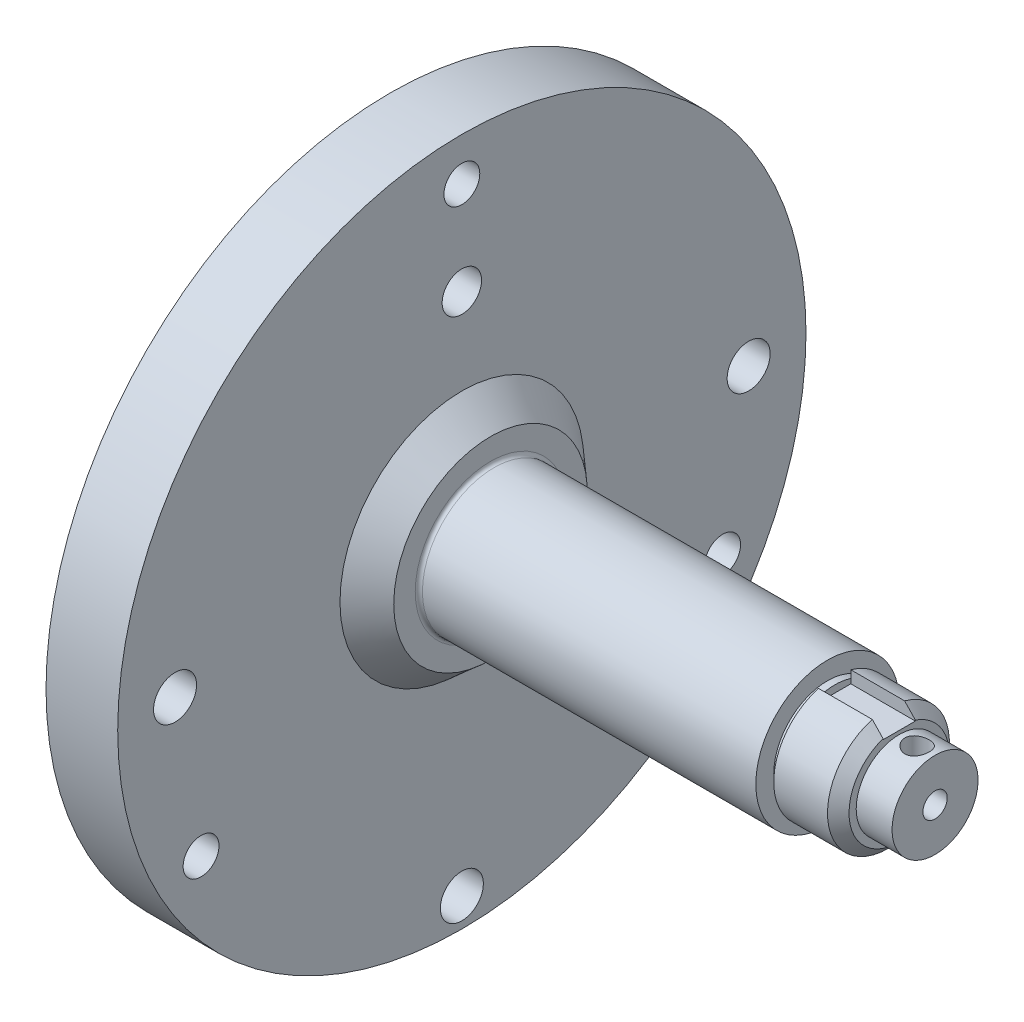
ISO-10303-21;
HEADER;
FILE_DESCRIPTION(('STEP AP214'),'2;1');
FILE_NAME('part.step','',(''),(''),'','','');
FILE_SCHEMA(('AUTOMOTIVE_DESIGN { 1 0 10303 214 1 1 1 1 }'));
ENDSEC;
DATA;
#1=APPLICATION_CONTEXT('core data for automotive mechanical design processes');
#2=APPLICATION_PROTOCOL_DEFINITION('international standard','automotive_design',2000,#1);
#3=PRODUCT_CONTEXT('',#1,'mechanical');
#4=PRODUCT('Part','Part','',(#3));
#5=PRODUCT_RELATED_PRODUCT_CATEGORY('part','',(#4));
#6=PRODUCT_DEFINITION_FORMATION('','',#4);
#7=PRODUCT_DEFINITION_CONTEXT('part definition',#1,'design');
#8=PRODUCT_DEFINITION('design','',#6,#7);
#9=PRODUCT_DEFINITION_SHAPE('','',#8);
#10=(LENGTH_UNIT() NAMED_UNIT(*) SI_UNIT(.MILLI.,.METRE.));
#11=(NAMED_UNIT(*) PLANE_ANGLE_UNIT() SI_UNIT($,.RADIAN.));
#12=(NAMED_UNIT(*) SI_UNIT($,.STERADIAN.) SOLID_ANGLE_UNIT());
#13=UNCERTAINTY_MEASURE_WITH_UNIT(LENGTH_MEASURE(1.E-05),#10,'distance_accuracy_value','');
#14=(GEOMETRIC_REPRESENTATION_CONTEXT(3) GLOBAL_UNCERTAINTY_ASSIGNED_CONTEXT((#13)) GLOBAL_UNIT_ASSIGNED_CONTEXT((#10,
#11,#12)) REPRESENTATION_CONTEXT('',''));
#15=CARTESIAN_POINT('',(0.,0.,0.));
#16=DIRECTION('',(0.,0.,1.));
#17=DIRECTION('',(1.,0.,0.));
#18=AXIS2_PLACEMENT_3D('',#15,#16,#17);
#19=CARTESIAN_POINT('',(0.,0.,0.));
#20=DIRECTION('',(-1.,0.,0.));
#21=DIRECTION('',(0.,0.,1.));
#22=AXIS2_PLACEMENT_3D('',#19,#20,#21);
#23=PLANE('',#22);
#24=CARTESIAN_POINT('',(0.,29.,0.));
#25=DIRECTION('',(-1.,0.,0.));
#26=DIRECTION('',(0.,0.,1.));
#27=AXIS2_PLACEMENT_3D('',#24,#25,#26);
#28=CIRCLE('',#27,2.75);
#29=CARTESIAN_POINT('',(0.,29.,2.75));
#30=VERTEX_POINT('',#29);
#31=EDGE_CURVE('E116',#30,#30,#28,.T.);
#32=ORIENTED_EDGE('',*,*,#31,.F.);
#33=EDGE_LOOP('',(#32));
#34=FACE_BOUND('',#33,.T.);
#35=CARTESIAN_POINT('',(0.,0.,0.));
#36=DIRECTION('',(-1.,0.,0.));
#37=DIRECTION('',(0.,0.,1.));
#38=AXIS2_PLACEMENT_3D('',#35,#36,#37);
#39=CIRCLE('',#38,35.);
#40=CARTESIAN_POINT('',(0.,0.,35.));
#41=VERTEX_POINT('',#40);
#42=EDGE_CURVE('E195',#41,#41,#39,.T.);
#43=ORIENTED_EDGE('',*,*,#42,.T.);
#44=EDGE_LOOP('',(#43));
#45=FACE_BOUND('',#44,.T.);
#46=ADVANCED_FACE('F36',(#34,#45),#23,.T.);
#47=CARTESIAN_POINT('',(-50.8434878965118,0.,0.));
#48=DIRECTION('',(-1.,0.,0.));
#49=DIRECTION('',(0.,0.,1.));
#50=AXIS2_PLACEMENT_3D('',#47,#48,#49);
#51=CYLINDRICAL_SURFACE('',#50,35.);
#52=CARTESIAN_POINT('',(-1.49999999999999,0.,0.));
#53=DIRECTION('',(-1.,0.,0.));
#54=DIRECTION('',(0.,0.,1.));
#55=AXIS2_PLACEMENT_3D('',#52,#53,#54);
#56=CIRCLE('',#55,35.);
#57=CARTESIAN_POINT('',(-1.49999999999999,0.,35.));
#58=VERTEX_POINT('',#57);
#59=EDGE_CURVE('E198',#58,#58,#56,.T.);
#60=ORIENTED_EDGE('',*,*,#59,.T.);
#61=EDGE_LOOP('',(#60));
#62=FACE_BOUND('',#61,.T.);
#63=ORIENTED_EDGE('',*,*,#42,.F.);
#64=EDGE_LOOP('',(#63));
#65=FACE_BOUND('',#64,.T.);
#66=ADVANCED_FACE('F184',(#62,#65),#51,.F.);
#67=CARTESIAN_POINT('',(-1.5,-48.,0.));
#68=DIRECTION('',(-1.,0.,0.));
#69=DIRECTION('',(0.,0.,1.));
#70=AXIS2_PLACEMENT_3D('',#67,#68,#69);
#71=PLANE('',#70);
#72=CARTESIAN_POINT('',(-1.5,42.,0.));
#73=DIRECTION('',(-1.,0.,0.));
#74=DIRECTION('',(0.,0.,1.));
#75=AXIS2_PLACEMENT_3D('',#72,#73,#74);
#76=CIRCLE('',#75,2.49999999999999);
#77=CARTESIAN_POINT('',(-1.5,42.,2.49999999999999));
#78=VERTEX_POINT('',#77);
#79=EDGE_CURVE('E163',#78,#78,#76,.T.);
#80=ORIENTED_EDGE('',*,*,#79,.F.);
#81=EDGE_LOOP('',(#80));
#82=FACE_BOUND('',#81,.T.);
#83=CARTESIAN_POINT('',(-1.5,-20.9999999999999,-36.3730669589465));
#84=DIRECTION('',(-1.,0.,0.));
#85=DIRECTION('',(0.,0.,1.));
#86=AXIS2_PLACEMENT_3D('',#83,#84,#85);
#87=CIRCLE('',#86,2.49999999999999);
#88=CARTESIAN_POINT('',(-1.5,-20.9999999999999,-33.8730669589465));
#89=VERTEX_POINT('',#88);
#90=EDGE_CURVE('E226',#89,#89,#87,.T.);
#91=ORIENTED_EDGE('',*,*,#90,.F.);
#92=EDGE_LOOP('',(#91));
#93=FACE_BOUND('',#92,.T.);
#94=CARTESIAN_POINT('',(-1.5,-20.9999999999999,36.3730669589465));
#95=DIRECTION('',(-1.,0.,0.));
#96=DIRECTION('',(0.,0.,1.));
#97=AXIS2_PLACEMENT_3D('',#94,#95,#96);
#98=CIRCLE('',#97,2.49999999999999);
#99=CARTESIAN_POINT('',(-1.5,-20.9999999999999,38.8730669589465));
#100=VERTEX_POINT('',#99);
#101=EDGE_CURVE('E222',#100,#100,#98,.T.);
#102=ORIENTED_EDGE('',*,*,#101,.F.);
#103=EDGE_LOOP('',(#102));
#104=FACE_BOUND('',#103,.T.);
#105=CARTESIAN_POINT('',(-1.5,-44.,0.));
#106=DIRECTION('',(-1.,0.,0.));
#107=DIRECTION('',(0.,0.,1.));
#108=AXIS2_PLACEMENT_3D('',#105,#106,#107);
#109=CIRCLE('',#108,3.);
#110=CARTESIAN_POINT('',(-1.5,-44.,3.));
#111=VERTEX_POINT('',#110);
#112=EDGE_CURVE('E218',#111,#111,#109,.T.);
#113=ORIENTED_EDGE('',*,*,#112,.F.);
#114=EDGE_LOOP('',(#113));
#115=FACE_BOUND('',#114,.T.);
#116=CARTESIAN_POINT('',(-1.5,0.,40.));
#117=DIRECTION('',(-1.,0.,0.));
#118=DIRECTION('',(0.,0.,1.));
#119=AXIS2_PLACEMENT_3D('',#116,#117,#118);
#120=CIRCLE('',#119,3.);
#121=CARTESIAN_POINT('',(-1.5,0.,43.));
#122=VERTEX_POINT('',#121);
#123=EDGE_CURVE('E214',#122,#122,#120,.T.);
#124=ORIENTED_EDGE('',*,*,#123,.F.);
#125=EDGE_LOOP('',(#124));
#126=FACE_BOUND('',#125,.T.);
#127=CARTESIAN_POINT('',(-1.5,0.,-40.));
#128=DIRECTION('',(-1.,0.,0.));
#129=DIRECTION('',(0.,0.,1.));
#130=AXIS2_PLACEMENT_3D('',#127,#128,#129);
#131=CIRCLE('',#130,3.);
#132=CARTESIAN_POINT('',(-1.5,0.,-37.));
#133=VERTEX_POINT('',#132);
#134=EDGE_CURVE('E210',#133,#133,#131,.T.);
#135=ORIENTED_EDGE('',*,*,#134,.F.);
#136=EDGE_LOOP('',(#135));
#137=FACE_BOUND('',#136,.T.);
#138=CARTESIAN_POINT('',(-1.5,0.,0.));
#139=DIRECTION('',(-1.,0.,0.));
#140=DIRECTION('',(0.,0.,1.));
#141=AXIS2_PLACEMENT_3D('',#138,#139,#140);
#142=CIRCLE('',#141,48.);
#143=CARTESIAN_POINT('',(-1.5,0.,48.));
#144=VERTEX_POINT('',#143);
#145=EDGE_CURVE('E202',#144,#144,#142,.T.);
#146=ORIENTED_EDGE('',*,*,#145,.T.);
#147=EDGE_LOOP('',(#146));
#148=FACE_BOUND('',#147,.T.);
#149=ORIENTED_EDGE('',*,*,#59,.F.);
#150=EDGE_LOOP('',(#149));
#151=FACE_BOUND('',#150,.T.);
#152=ADVANCED_FACE('F189',(#82,#93,#104,#115,#126,#137,#148,#151),#71,.T.);
#153=CARTESIAN_POINT('',(-50.8434878965118,0.,0.));
#154=DIRECTION('',(-1.,0.,0.));
#155=DIRECTION('',(0.,0.,1.));
#156=AXIS2_PLACEMENT_3D('',#153,#154,#155);
#157=CYLINDRICAL_SURFACE('',#156,48.);
#158=CARTESIAN_POINT('',(8.50000000000001,0.,0.));
#159=DIRECTION('',(-1.,0.,0.));
#160=DIRECTION('',(0.,0.,1.));
#161=AXIS2_PLACEMENT_3D('',#158,#159,#160);
#162=CIRCLE('',#161,48.);
#163=CARTESIAN_POINT('',(8.50000000000001,0.,48.));
#164=VERTEX_POINT('',#163);
#165=EDGE_CURVE('E271',#164,#164,#162,.T.);
#166=ORIENTED_EDGE('',*,*,#165,.T.);
#167=EDGE_LOOP('',(#166));
#168=FACE_BOUND('',#167,.T.);
#169=ORIENTED_EDGE('',*,*,#145,.F.);
#170=EDGE_LOOP('',(#169));
#171=FACE_BOUND('',#170,.T.);
#172=ADVANCED_FACE('F278',(#168,#171),#157,.T.);
#173=CARTESIAN_POINT('',(8.5,-17.,0.));
#174=DIRECTION('',(1.,0.,0.));
#175=DIRECTION('',(0.,0.,-1.));
#176=AXIS2_PLACEMENT_3D('',#173,#174,#175);
#177=PLANE('',#176);
#178=CARTESIAN_POINT('',(8.5,29.,0.));
#179=DIRECTION('',(1.,0.,0.));
#180=DIRECTION('',(0.,0.,-1.));
#181=AXIS2_PLACEMENT_3D('',#178,#179,#180);
#182=CIRCLE('',#181,2.75);
#183=CARTESIAN_POINT('',(8.5,29.,-2.75));
#184=VERTEX_POINT('',#183);
#185=EDGE_CURVE('E119',#184,#184,#182,.T.);
#186=ORIENTED_EDGE('',*,*,#185,.F.);
#187=EDGE_LOOP('',(#186));
#188=FACE_BOUND('',#187,.T.);
#189=CARTESIAN_POINT('',(8.5,42.,0.));
#190=DIRECTION('',(1.,0.,0.));
#191=DIRECTION('',(0.,0.,-1.));
#192=AXIS2_PLACEMENT_3D('',#189,#190,#191);
#193=CIRCLE('',#192,2.49999999999999);
#194=CARTESIAN_POINT('',(8.5,42.,-2.49999999999999));
#195=VERTEX_POINT('',#194);
#196=EDGE_CURVE('E227',#195,#195,#193,.T.);
#197=ORIENTED_EDGE('',*,*,#196,.F.);
#198=EDGE_LOOP('',(#197));
#199=FACE_BOUND('',#198,.T.);
#200=CARTESIAN_POINT('',(8.5,-20.9999999999999,-36.3730669589465));
#201=DIRECTION('',(1.,0.,0.));
#202=DIRECTION('',(0.,0.,-1.));
#203=AXIS2_PLACEMENT_3D('',#200,#201,#202);
#204=CIRCLE('',#203,2.49999999999999);
#205=CARTESIAN_POINT('',(8.5,-20.9999999999999,-38.8730669589465));
#206=VERTEX_POINT('',#205);
#207=EDGE_CURVE('E223',#206,#206,#204,.T.);
#208=ORIENTED_EDGE('',*,*,#207,.F.);
#209=EDGE_LOOP('',(#208));
#210=FACE_BOUND('',#209,.T.);
#211=CARTESIAN_POINT('',(8.5,-20.9999999999999,36.3730669589465));
#212=DIRECTION('',(1.,0.,0.));
#213=DIRECTION('',(0.,0.,-1.));
#214=AXIS2_PLACEMENT_3D('',#211,#212,#213);
#215=CIRCLE('',#214,2.49999999999999);
#216=CARTESIAN_POINT('',(8.5,-20.9999999999999,33.8730669589465));
#217=VERTEX_POINT('',#216);
#218=EDGE_CURVE('E219',#217,#217,#215,.T.);
#219=ORIENTED_EDGE('',*,*,#218,.F.);
#220=EDGE_LOOP('',(#219));
#221=FACE_BOUND('',#220,.T.);
#222=CARTESIAN_POINT('',(8.50000000000001,-44.,0.));
#223=DIRECTION('',(1.,0.,0.));
#224=DIRECTION('',(0.,0.,-1.));
#225=AXIS2_PLACEMENT_3D('',#222,#223,#224);
#226=CIRCLE('',#225,3.);
#227=CARTESIAN_POINT('',(8.50000000000001,-44.,-3.));
#228=VERTEX_POINT('',#227);
#229=EDGE_CURVE('E215',#228,#228,#226,.T.);
#230=ORIENTED_EDGE('',*,*,#229,.F.);
#231=EDGE_LOOP('',(#230));
#232=FACE_BOUND('',#231,.T.);
#233=CARTESIAN_POINT('',(8.50000000000001,0.,40.));
#234=DIRECTION('',(1.,0.,0.));
#235=DIRECTION('',(0.,0.,-1.));
#236=AXIS2_PLACEMENT_3D('',#233,#234,#235);
#237=CIRCLE('',#236,3.);
#238=CARTESIAN_POINT('',(8.50000000000001,0.,37.));
#239=VERTEX_POINT('',#238);
#240=EDGE_CURVE('E211',#239,#239,#237,.T.);
#241=ORIENTED_EDGE('',*,*,#240,.F.);
#242=EDGE_LOOP('',(#241));
#243=FACE_BOUND('',#242,.T.);
#244=CARTESIAN_POINT('',(8.50000000000001,0.,-40.));
#245=DIRECTION('',(1.,0.,0.));
#246=DIRECTION('',(0.,0.,-1.));
#247=AXIS2_PLACEMENT_3D('',#244,#245,#246);
#248=CIRCLE('',#247,3.);
#249=CARTESIAN_POINT('',(8.50000000000001,0.,-43.));
#250=VERTEX_POINT('',#249);
#251=EDGE_CURVE('E206',#250,#250,#248,.T.);
#252=ORIENTED_EDGE('',*,*,#251,.F.);
#253=EDGE_LOOP('',(#252));
#254=FACE_BOUND('',#253,.T.);
#255=CARTESIAN_POINT('',(8.5,0.,0.));
#256=DIRECTION('',(-1.,0.,0.));
#257=DIRECTION('',(0.,0.,1.));
#258=AXIS2_PLACEMENT_3D('',#255,#256,#257);
#259=CIRCLE('',#258,17.);
#260=CARTESIAN_POINT('',(8.5,0.,17.));
#261=VERTEX_POINT('',#260);
#262=EDGE_CURVE('E268',#261,#261,#259,.T.);
#263=ORIENTED_EDGE('',*,*,#262,.T.);
#264=EDGE_LOOP('',(#263));
#265=FACE_BOUND('',#264,.T.);
#266=ORIENTED_EDGE('',*,*,#165,.F.);
#267=EDGE_LOOP('',(#266));
#268=FACE_BOUND('',#267,.T.);
#269=ADVANCED_FACE('F280',(#188,#199,#210,#221,#232,#243,#254,#265,#268),#177,.T.);
#270=CARTESIAN_POINT('',(8.5,0.,0.));
#271=DIRECTION('',(-1.,0.,0.));
#272=DIRECTION('',(0.,0.,1.));
#273=AXIS2_PLACEMENT_3D('',#270,#271,#272);
#274=CONICAL_SURFACE('',#273,17.,0.718829999621625);
#275=CARTESIAN_POINT('',(12.5,0.,0.));
#276=DIRECTION('',(-1.,0.,0.));
#277=DIRECTION('',(0.,0.,1.));
#278=AXIS2_PLACEMENT_3D('',#275,#276,#277);
#279=CIRCLE('',#278,13.5);
#280=CARTESIAN_POINT('',(12.5,0.,13.5));
#281=VERTEX_POINT('',#280);
#282=EDGE_CURVE('E265',#281,#281,#279,.T.);
#283=ORIENTED_EDGE('',*,*,#282,.T.);
#284=EDGE_LOOP('',(#283));
#285=FACE_BOUND('',#284,.T.);
#286=ORIENTED_EDGE('',*,*,#262,.F.);
#287=EDGE_LOOP('',(#286));
#288=FACE_BOUND('',#287,.T.);
#289=ADVANCED_FACE('F287',(#285,#288),#274,.T.);
#290=CARTESIAN_POINT('',(12.5,-13.5,0.));
#291=DIRECTION('',(1.,0.,0.));
#292=DIRECTION('',(0.,0.,-1.));
#293=AXIS2_PLACEMENT_3D('',#290,#291,#292);
#294=PLANE('',#293);
#295=CARTESIAN_POINT('',(12.5,0.,0.));
#296=DIRECTION('',(-1.,0.,0.));
#297=DIRECTION('',(0.,0.,1.));
#298=AXIS2_PLACEMENT_3D('',#295,#296,#297);
#299=CIRCLE('',#298,10.5);
#300=CARTESIAN_POINT('',(12.5,0.,10.5));
#301=VERTEX_POINT('',#300);
#302=EDGE_CURVE('E262',#301,#301,#299,.T.);
#303=ORIENTED_EDGE('',*,*,#302,.T.);
#304=EDGE_LOOP('',(#303));
#305=FACE_BOUND('',#304,.T.);
#306=ORIENTED_EDGE('',*,*,#282,.F.);
#307=EDGE_LOOP('',(#306));
#308=FACE_BOUND('',#307,.T.);
#309=ADVANCED_FACE('F295',(#305,#308),#294,.T.);
#310=CARTESIAN_POINT('',(13.,0.,0.));
#311=DIRECTION('',(-1.,0.,0.));
#312=DIRECTION('',(0.,0.,1.));
#313=AXIS2_PLACEMENT_3D('',#310,#311,#312);
#314=TOROIDAL_SURFACE('',#313,10.5,0.5);
#315=CARTESIAN_POINT('',(13.,0.,0.));
#316=DIRECTION('',(-1.,0.,0.));
#317=DIRECTION('',(0.,0.,1.));
#318=AXIS2_PLACEMENT_3D('',#315,#316,#317);
#319=CIRCLE('',#318,10.);
#320=CARTESIAN_POINT('',(13.,0.,10.));
#321=VERTEX_POINT('',#320);
#322=EDGE_CURVE('E259',#321,#321,#319,.T.);
#323=ORIENTED_EDGE('',*,*,#322,.T.);
#324=EDGE_LOOP('',(#323));
#325=FACE_BOUND('',#324,.T.);
#326=ORIENTED_EDGE('',*,*,#302,.F.);
#327=EDGE_LOOP('',(#326));
#328=FACE_BOUND('',#327,.T.);
#329=ADVANCED_FACE('F299',(#325,#328),#314,.F.);
#330=CARTESIAN_POINT('',(-50.8434878965118,0.,0.));
#331=DIRECTION('',(-1.,0.,0.));
#332=DIRECTION('',(0.,0.,1.));
#333=AXIS2_PLACEMENT_3D('',#330,#331,#332);
#334=CYLINDRICAL_SURFACE('',#333,10.);
#335=CARTESIAN_POINT('',(59.5,0.,0.));
#336=DIRECTION('',(-1.,0.,0.));
#337=DIRECTION('',(0.,0.,1.));
#338=AXIS2_PLACEMENT_3D('',#335,#336,#337);
#339=CIRCLE('',#338,9.99999999999999);
#340=CARTESIAN_POINT('',(59.5,0.,9.99999999999999));
#341=VERTEX_POINT('',#340);
#342=EDGE_CURVE('E256',#341,#341,#339,.T.);
#343=ORIENTED_EDGE('',*,*,#342,.T.);
#344=EDGE_LOOP('',(#343));
#345=FACE_BOUND('',#344,.T.);
#346=ORIENTED_EDGE('',*,*,#322,.F.);
#347=EDGE_LOOP('',(#346));
#348=FACE_BOUND('',#347,.T.);
#349=ADVANCED_FACE('F303',(#345,#348),#334,.T.);
#350=CARTESIAN_POINT('',(59.5,-7.5,0.));
#351=DIRECTION('',(1.,0.,0.));
#352=DIRECTION('',(0.,0.,-1.));
#353=AXIS2_PLACEMENT_3D('',#350,#351,#352);
#354=PLANE('',#353);
#355=CARTESIAN_POINT('',(59.5,0.,0.));
#356=DIRECTION('',(-1.,0.,0.));
#357=DIRECTION('',(0.,0.,1.));
#358=AXIS2_PLACEMENT_3D('',#355,#356,#357);
#359=CIRCLE('',#358,7.5);
#360=CARTESIAN_POINT('',(59.5,0.,7.5));
#361=VERTEX_POINT('',#360);
#362=EDGE_CURVE('E253',#361,#361,#359,.T.);
#363=ORIENTED_EDGE('',*,*,#362,.T.);
#364=EDGE_LOOP('',(#363));
#365=FACE_BOUND('',#364,.T.);
#366=ORIENTED_EDGE('',*,*,#342,.F.);
#367=EDGE_LOOP('',(#366));
#368=FACE_BOUND('',#367,.T.);
#369=ADVANCED_FACE('F307',(#365,#368),#354,.T.);
#370=CARTESIAN_POINT('',(-50.8434878965118,0.,0.));
#371=DIRECTION('',(-1.,0.,0.));
#372=DIRECTION('',(0.,0.,1.));
#373=AXIS2_PLACEMENT_3D('',#370,#371,#372);
#374=CYLINDRICAL_SURFACE('',#373,7.5);
#375=CARTESIAN_POINT('',(60.5,0.,0.));
#376=DIRECTION('',(-1.,0.,0.));
#377=DIRECTION('',(0.,0.,1.));
#378=AXIS2_PLACEMENT_3D('',#375,#376,#377);
#379=CIRCLE('',#378,7.5);
#380=CARTESIAN_POINT('',(60.5,7.15454401062709,2.25));
#381=VERTEX_POINT('',#380);
#382=CARTESIAN_POINT('',(60.5,7.15454401062709,-2.25));
#383=VERTEX_POINT('',#382);
#384=EDGE_CURVE('E102',#381,#383,#379,.T.);
#385=ORIENTED_EDGE('',*,*,#384,.T.);
#386=EDGE_CURVE('E251',#383,#381,#379,.T.);
#387=ORIENTED_EDGE('',*,*,#386,.T.);
#388=EDGE_LOOP('',(#385,#387));
#389=FACE_BOUND('',#388,.T.);
#390=ORIENTED_EDGE('',*,*,#362,.F.);
#391=EDGE_LOOP('',(#390));
#392=FACE_BOUND('',#391,.T.);
#393=ADVANCED_FACE('F311',(#389,#392),#374,.T.);
#394=CARTESIAN_POINT('',(60.5,-8.5,0.));
#395=DIRECTION('',(-1.,0.,0.));
#396=DIRECTION('',(0.,0.,1.));
#397=AXIS2_PLACEMENT_3D('',#394,#395,#396);
#398=PLANE('',#397);
#399=DIRECTION('',(0.,1.,0.));
#400=VECTOR('',#399,1.);
#401=CARTESIAN_POINT('',(60.5,6.5,-2.25));
#402=LINE('',#401,#400);
#403=CARTESIAN_POINT('',(60.5,8.1967981553775,-2.25));
#404=VERTEX_POINT('',#403);
#405=EDGE_CURVE('E105',#383,#404,#402,.T.);
#406=ORIENTED_EDGE('',*,*,#405,.T.);
#407=CARTESIAN_POINT('',(60.5,0.,0.));
#408=DIRECTION('',(-1.,0.,0.));
#409=DIRECTION('',(0.,0.,1.));
#410=AXIS2_PLACEMENT_3D('',#407,#408,#409);
#411=CIRCLE('',#410,8.5);
#412=CARTESIAN_POINT('',(60.5,8.1967981553775,2.25));
#413=VERTEX_POINT('',#412);
#414=EDGE_CURVE('E242',#404,#413,#411,.T.);
#415=ORIENTED_EDGE('',*,*,#414,.T.);
#416=DIRECTION('',(0.,1.,0.));
#417=VECTOR('',#416,1.);
#418=CARTESIAN_POINT('',(60.5,6.5,2.25));
#419=LINE('',#418,#417);
#420=EDGE_CURVE('E106',#381,#413,#419,.T.);
#421=ORIENTED_EDGE('',*,*,#420,.F.);
#422=ORIENTED_EDGE('',*,*,#386,.F.);
#423=EDGE_LOOP('',(#406,#415,#421,#422));
#424=FACE_BOUND('',#423,.T.);
#425=ADVANCED_FACE('F315',(#424),#398,.T.);
#426=CARTESIAN_POINT('',(-50.8434878965118,0.,0.));
#427=DIRECTION('',(-1.,0.,0.));
#428=DIRECTION('',(0.,0.,1.));
#429=AXIS2_PLACEMENT_3D('',#426,#427,#428);
#430=CYLINDRICAL_SURFACE('',#429,8.5);
#431=DIRECTION('',(-1.,0.,0.));
#432=VECTOR('',#431,1.);
#433=CARTESIAN_POINT('',(-50.8434878965118,8.1967981553775,-2.25));
#434=LINE('',#433,#432);
#435=CARTESIAN_POINT('',(68.,8.1967981553775,-2.25));
#436=VERTEX_POINT('',#435);
#437=EDGE_CURVE('E164',#436,#404,#434,.T.);
#438=ORIENTED_EDGE('',*,*,#437,.F.);
#439=CARTESIAN_POINT('',(68.,0.,0.));
#440=DIRECTION('',(-1.,0.,0.));
#441=DIRECTION('',(0.,0.,1.));
#442=AXIS2_PLACEMENT_3D('',#439,#440,#441);
#443=CIRCLE('',#442,8.5);
#444=CARTESIAN_POINT('',(68.,8.1967981553775,2.25));
#445=VERTEX_POINT('',#444);
#446=EDGE_CURVE('E238',#436,#445,#443,.T.);
#447=ORIENTED_EDGE('',*,*,#446,.T.);
#448=DIRECTION('',(-1.,0.,0.));
#449=VECTOR('',#448,1.);
#450=CARTESIAN_POINT('',(-50.8434878965118,8.1967981553775,2.25000000000001));
#451=LINE('',#450,#449);
#452=EDGE_CURVE('E133',#413,#445,#451,.F.);
#453=ORIENTED_EDGE('',*,*,#452,.F.);
#454=ORIENTED_EDGE('',*,*,#414,.F.);
#455=EDGE_LOOP('',(#438,#447,#453,#454));
#456=FACE_BOUND('',#455,.T.);
#457=ADVANCED_FACE('F179',(#456),#430,.T.);
#458=CARTESIAN_POINT('',(68.,0.,0.));
#459=DIRECTION('',(-1.,0.,0.));
#460=DIRECTION('',(0.,0.,1.));
#461=AXIS2_PLACEMENT_3D('',#458,#459,#460);
#462=CONICAL_SURFACE('',#461,8.5,0.785398163397446);
#463=CARTESIAN_POINT('',(71.8834234597446,4.03116347374259,-2.25));
#464=CARTESIAN_POINT('',(71.7531466573695,4.18030913853117,-2.25));
#465=CARTESIAN_POINT('',(71.6219502259988,4.3286442484899,-2.25));
#466=CARTESIAN_POINT('',(71.358085654199,4.62399117141458,-2.25));
#467=CARTESIAN_POINT('',(71.2254175666967,4.77100303162765,-2.25));
#468=CARTESIAN_POINT('',(70.958980630892,5.06399785068825,-2.25));
#469=CARTESIAN_POINT('',(70.8252118895034,5.20998090697145,-2.25));
#470=CARTESIAN_POINT('',(70.5567876628965,5.50113175237221,-2.25));
#471=CARTESIAN_POINT('',(70.4221321684943,5.64629953301734,-2.25));
#472=CARTESIAN_POINT('',(70.0171568750863,6.08077479179357,-2.25));
#473=CARTESIAN_POINT('',(69.7457851283322,6.36910137507147,-2.25));
#474=CARTESIAN_POINT('',(69.2011624356661,6.94398552433444,-2.25));
#475=CARTESIAN_POINT('',(68.9279114359848,7.23054303925378,-2.25));
#476=CARTESIAN_POINT('',(68.3801307926806,7.80233887670289,-2.25));
#477=CARTESIAN_POINT('',(68.1056013748941,8.08757741572141,-2.25));
#478=CARTESIAN_POINT('',(67.5555772540861,8.65711507285681,-2.25));
#479=CARTESIAN_POINT('',(67.2800825624726,8.94141420199944,-2.25));
#480=CARTESIAN_POINT('',(66.7283260772347,9.5093457390224,-2.25));
#481=CARTESIAN_POINT('',(66.4520641795961,9.79297804579988,-2.25));
#482=CARTESIAN_POINT('',(65.8989694286879,10.3596846330316,-2.25));
#483=CARTESIAN_POINT('',(65.6221365763339,10.6427589143791,-2.25));
#484=CARTESIAN_POINT('',(65.345096266554,10.9256293778641,-2.25));
#485=B_SPLINE_CURVE_WITH_KNOTS('',3,(#463,#464,#465,#466,#467,#468,#469,#470,#471,#472,#473,
#474,#475,#476,#477,#478,#479,#480,#481,#482,#483,#484),.UNSPECIFIED.,.F.,.F.,(4,2,2,2,2,2,2,2,
2,2,4),(0.,0.594082834444634,1.18814437211197,1.78214887036267,2.37615953019791,3.5639890568474,
4.75185271241163,5.93951393762722,7.12716117353148,8.31497816053797,9.50279324459302),.UNSPECIFIED.);
#486=CARTESIAN_POINT('',(69.5,6.62853679178143,-2.25));
#487=VERTEX_POINT('',#486);
#488=EDGE_CURVE('E328',#487,#436,#485,.T.);
#489=ORIENTED_EDGE('',*,*,#488,.F.);
#490=CARTESIAN_POINT('',(69.5,0.,0.));
#491=DIRECTION('',(-1.,0.,0.));
#492=DIRECTION('',(0.,0.,1.));
#493=AXIS2_PLACEMENT_3D('',#490,#491,#492);
#494=CIRCLE('',#493,7.00000000000001);
#495=CARTESIAN_POINT('',(69.5,6.62853679178143,2.25));
#496=VERTEX_POINT('',#495);
#497=EDGE_CURVE('E236',#487,#496,#494,.T.);
#498=ORIENTED_EDGE('',*,*,#497,.T.);
#499=CARTESIAN_POINT('',(65.345096266554,10.9256293778641,2.25));
#500=CARTESIAN_POINT('',(65.6221365763339,10.6427589143791,2.25));
#501=CARTESIAN_POINT('',(65.8989694286879,10.3596846330316,2.25));
#502=CARTESIAN_POINT('',(66.452064179596,9.79297804579988,2.25));
#503=CARTESIAN_POINT('',(66.7283260772347,9.5093457390224,2.25));
#504=CARTESIAN_POINT('',(67.2800825624726,8.94141420199944,2.25));
#505=CARTESIAN_POINT('',(67.5555772540861,8.65711507285681,2.25));
#506=CARTESIAN_POINT('',(68.1056013748941,8.0875774157214,2.25));
#507=CARTESIAN_POINT('',(68.3801307926806,7.80233887670288,2.25));
#508=CARTESIAN_POINT('',(68.9279114359848,7.23054303925378,2.25));
#509=CARTESIAN_POINT('',(69.2011624356662,6.94398552433443,2.25));
#510=CARTESIAN_POINT('',(69.7457851283322,6.36910137507147,2.25));
#511=CARTESIAN_POINT('',(70.0171568750863,6.08077479179357,2.25));
#512=CARTESIAN_POINT('',(70.4221321684943,5.64629953301734,2.25));
#513=CARTESIAN_POINT('',(70.5567876628965,5.50113175237221,2.25));
#514=CARTESIAN_POINT('',(70.8252118895034,5.20998090697144,2.25));
#515=CARTESIAN_POINT('',(70.958980630892,5.06399785068824,2.25));
#516=CARTESIAN_POINT('',(71.2254175666967,4.77100303162765,2.25));
#517=CARTESIAN_POINT('',(71.358085654199,4.62399117141457,2.25));
#518=CARTESIAN_POINT('',(71.6219502259988,4.3286442484899,2.25));
#519=CARTESIAN_POINT('',(71.7531466573695,4.18030913853117,2.25));
#520=CARTESIAN_POINT('',(71.8834234597446,4.03116347374259,2.25));
#521=B_SPLINE_CURVE_WITH_KNOTS('',3,(#499,#500,#501,#502,#503,#504,#505,#506,#507,#508,#509,
#510,#511,#512,#513,#514,#515,#516,#517,#518,#519,#520),.UNSPECIFIED.,.F.,.F.,(4,2,2,2,2,2,2,2,
2,2,4),(0.,1.18781508405503,2.37563207106154,3.5632793069658,4.75094053218139,5.93880418774563,
7.12663371439511,7.72064437423035,8.31464887248105,8.90871041014838,9.50279324459302),.UNSPECIFIED.);
#522=EDGE_CURVE('E125',#445,#496,#521,.T.);
#523=ORIENTED_EDGE('',*,*,#522,.F.);
#524=ORIENTED_EDGE('',*,*,#446,.F.);
#525=EDGE_LOOP('',(#489,#498,#523,#524));
#526=FACE_BOUND('',#525,.T.);
#527=ADVANCED_FACE('F135',(#526),#462,.T.);
#528=CARTESIAN_POINT('',(69.5,-6.,0.));
#529=DIRECTION('',(1.,0.,0.));
#530=DIRECTION('',(0.,0.,-1.));
#531=AXIS2_PLACEMENT_3D('',#528,#529,#530);
#532=PLANE('',#531);
#533=DIRECTION('',(0.,1.,0.));
#534=VECTOR('',#533,1.);
#535=CARTESIAN_POINT('',(69.5,-6.,-2.25));
#536=LINE('',#535,#534);
#537=CARTESIAN_POINT('',(69.5,6.5,-2.25));
#538=VERTEX_POINT('',#537);
#539=EDGE_CURVE('E11',#538,#487,#536,.T.);
#540=ORIENTED_EDGE('',*,*,#539,.F.);
#541=DIRECTION('',(0.,0.,-1.));
#542=VECTOR('',#541,1.);
#543=CARTESIAN_POINT('',(69.5,6.5,0.));
#544=LINE('',#543,#542);
#545=CARTESIAN_POINT('',(69.5,6.5,2.25));
#546=VERTEX_POINT('',#545);
#547=EDGE_CURVE('E231',#546,#538,#544,.T.);
#548=ORIENTED_EDGE('',*,*,#547,.F.);
#549=DIRECTION('',(0.,-1.,0.));
#550=VECTOR('',#549,1.);
#551=CARTESIAN_POINT('',(69.5,-6.,2.25));
#552=LINE('',#551,#550);
#553=EDGE_CURVE('E43',#496,#546,#552,.T.);
#554=ORIENTED_EDGE('',*,*,#553,.F.);
#555=ORIENTED_EDGE('',*,*,#497,.F.);
#556=EDGE_LOOP('',(#540,#548,#554,#555));
#557=FACE_BOUND('',#556,.T.);
#558=CARTESIAN_POINT('',(69.5,0.,0.));
#559=DIRECTION('',(-1.,0.,0.));
#560=DIRECTION('',(0.,0.,1.));
#561=AXIS2_PLACEMENT_3D('',#558,#559,#560);
#562=CIRCLE('',#561,6.);
#563=CARTESIAN_POINT('',(69.5,0.,6.));
#564=VERTEX_POINT('',#563);
#565=EDGE_CURVE('E239',#564,#564,#562,.T.);
#566=ORIENTED_EDGE('',*,*,#565,.T.);
#567=EDGE_LOOP('',(#566));
#568=FACE_BOUND('',#567,.T.);
#569=ADVANCED_FACE('F171',(#557,#568),#532,.T.);
#570=CARTESIAN_POINT('',(-50.8434878965118,0.,0.));
#571=DIRECTION('',(-1.,0.,0.));
#572=DIRECTION('',(0.,0.,1.));
#573=AXIS2_PLACEMENT_3D('',#570,#571,#572);
#574=CYLINDRICAL_SURFACE('',#573,6.);
#575=CARTESIAN_POINT('',(72.,5.75412895232632,1.69999999999999));
#576=CARTESIAN_POINT('',(72.0934093691853,5.75413030705025,1.69999823830273));
#577=CARTESIAN_POINT('',(72.1868366372782,5.75642836909227,1.6922749817906));
#578=CARTESIAN_POINT('',(72.3709768006053,5.76534041087339,1.66165467971466));
#579=CARTESIAN_POINT('',(72.4616885425335,5.7719561979322,1.63875127996163));
#580=CARTESIAN_POINT('',(72.6377064885041,5.7886955762863,1.5785970974694));
#581=CARTESIAN_POINT('',(72.7230207317486,5.79881379817282,1.54136826663979));
#582=CARTESIAN_POINT('',(72.8862097742323,5.82141093373703,1.45369052736141));
#583=CARTESIAN_POINT('',(72.9640837271816,5.83389011548028,1.40324011747162));
#584=CARTESIAN_POINT('',(73.1123797763255,5.8601980016344,1.28902748689304));
#585=CARTESIAN_POINT('',(73.1825607556866,5.87405303278172,1.2249581910414));
#586=CARTESIAN_POINT('',(73.3113394032792,5.90132543254982,1.08598577137089));
#587=CARTESIAN_POINT('',(73.3699357358755,5.91474275055636,1.01108140005939));
#588=CARTESIAN_POINT('',(73.4749073577491,5.93992430966911,0.850872052249868));
#589=CARTESIAN_POINT('',(73.5210399497219,5.95165389137678,0.765402134061058));
#590=CARTESIAN_POINT('',(73.5981866245389,5.97183445838297,0.587530081635254));
#591=CARTESIAN_POINT('',(73.6292035998121,5.98028607086977,0.495129277556798));
#592=CARTESIAN_POINT('',(73.6744496887862,5.9927722205952,0.308538063785362));
#593=CARTESIAN_POINT('',(73.6890896568874,5.99691466635158,0.214454630615159));
#594=CARTESIAN_POINT('',(73.7024619404141,6.00069435538165,0.0250819306975583));
#595=CARTESIAN_POINT('',(73.7011972479661,6.00033244605491,-0.0702071058713205));
#596=CARTESIAN_POINT('',(73.6830788620213,5.99522191580181,-0.256415442488988));
#597=CARTESIAN_POINT('',(73.6666695427404,5.990598345706,-0.347381944863195));
#598=CARTESIAN_POINT('',(73.6194494781966,5.97763369670876,-0.525212909851139));
#599=CARTESIAN_POINT('',(73.5886378631022,5.96929239327495,-0.612077124356849));
#600=CARTESIAN_POINT('',(73.5131668166745,5.94965018703354,-0.780334003454941));
#601=CARTESIAN_POINT('',(73.4683612646966,5.93831826014872,-0.861657355328363));
#602=CARTESIAN_POINT('',(73.3662879384676,5.91390668322503,-1.01577810207823));
#603=CARTESIAN_POINT('',(73.3090174710745,5.90082665573149,-1.08857364921957));
#604=CARTESIAN_POINT('',(73.1813069131161,5.87379484937807,-1.22622537323731));
#605=CARTESIAN_POINT('',(73.110480343966,5.85982856458942,-1.290720585108));
#606=CARTESIAN_POINT('',(72.9588755175598,5.83299973673959,-1.40701296704874));
#607=CARTESIAN_POINT('',(72.8780964811515,5.82013728022809,-1.45880914199461));
#608=CARTESIAN_POINT('',(72.7080162589732,5.79690853211453,-1.54855629559795));
#609=CARTESIAN_POINT('',(72.6186539733014,5.78656232313894,-1.58639705427858));
#610=CARTESIAN_POINT('',(72.4344672213255,5.7697807088064,-1.64639365236264));
#611=CARTESIAN_POINT('',(72.3396443219862,5.76334418759671,-1.66855396737444));
#612=CARTESIAN_POINT('',(72.1506332134226,5.7553519924334,-1.69591307016207));
#613=CARTESIAN_POINT('',(72.0565302017956,5.75363999869221,-1.70165532069625));
#614=CARTESIAN_POINT('',(71.8687060204805,5.75486075604466,-1.69752257669006));
#615=CARTESIAN_POINT('',(71.7749848054873,5.75779293894094,-1.68764949262675));
#616=CARTESIAN_POINT('',(71.5927613708484,5.76781946163649,-1.65304794039367));
#617=CARTESIAN_POINT('',(71.5041892599136,5.77481905005664,-1.62865735710091));
#618=CARTESIAN_POINT('',(71.3323963274626,5.79209640322144,-1.56609880032159));
#619=CARTESIAN_POINT('',(71.2491762710032,5.80237463539028,-1.52792886226088));
#620=CARTESIAN_POINT('',(71.0882068260563,5.82536335834894,-1.43782736656046));
#621=CARTESIAN_POINT('',(71.0106404181773,5.838127066957,-1.38558281215744));
#622=CARTESIAN_POINT('',(70.865176351614,5.86452880221061,-1.26919507044764));
#623=CARTESIAN_POINT('',(70.7972807582422,5.87816701471727,-1.20504934822586));
#624=CARTESIAN_POINT('',(70.67077110308,5.90532808830334,-1.06414609663509));
#625=CARTESIAN_POINT('',(70.6125391551457,5.91883215152531,-0.987041086771326));
#626=CARTESIAN_POINT('',(70.5098385788848,5.94374387174674,-0.823839940422294));
#627=CARTESIAN_POINT('',(70.4653692275161,5.95515163886598,-0.737744276594659));
#628=CARTESIAN_POINT('',(70.3918792191665,5.9745125365529,-0.559604277216343));
#629=CARTESIAN_POINT('',(70.3627416359303,5.98249172646265,-0.46761115075945));
#630=CARTESIAN_POINT('',(70.3204194958481,5.99421149613539,-0.279770896760117));
#631=CARTESIAN_POINT('',(70.3072309090258,5.99795314662038,-0.183924749122307));
#632=CARTESIAN_POINT('',(70.2974602527169,6.0007185259692,0.00535045960767693));
#633=CARTESIAN_POINT('',(70.3003209334759,5.99990057605679,0.0987488232605827));
#634=CARTESIAN_POINT('',(70.3212551297474,5.99400405491162,0.283679867465305));
#635=CARTESIAN_POINT('',(70.3393279377295,5.98892568183518,0.375212634584986));
#636=CARTESIAN_POINT('',(70.3898428885623,5.97511725290715,0.553053012106335));
#637=CARTESIAN_POINT('',(70.422159207379,5.96641920917938,0.639399015299903));
#638=CARTESIAN_POINT('',(70.5001319356844,5.94627535632756,0.805491358738708));
#639=CARTESIAN_POINT('',(70.5457903876261,5.93482912655101,0.885236686132849));
#640=CARTESIAN_POINT('',(70.6507100329586,5.90998442427344,1.03840499708776));
#641=CARTESIAN_POINT('',(70.7103311979325,5.8965385061811,1.1115736626332));
#642=CARTESIAN_POINT('',(70.8408180669641,5.86938134425617,1.24705519301111));
#643=CARTESIAN_POINT('',(70.9116868572408,5.85567002851084,1.3093650684426));
#644=CARTESIAN_POINT('',(71.0648466681824,5.82912408094697,1.42295797513548));
#645=CARTESIAN_POINT('',(71.1473844752806,5.81632104488298,1.47391638235687));
#646=CARTESIAN_POINT('',(71.3202080116516,5.79351413023044,1.56116635546593));
#647=CARTESIAN_POINT('',(71.4104892720517,5.78350865114223,1.59746631284637));
#648=CARTESIAN_POINT('',(71.5835233730758,5.76862765224223,1.65032735276839));
#649=CARTESIAN_POINT('',(71.6656202021384,5.7632381078861,1.66890730120089));
#650=CARTESIAN_POINT('',(71.8318067200535,5.75598841555481,1.69374348383974));
#651=CARTESIAN_POINT('',(71.9158961048521,5.75412773256047,1.70000158619636));
#652=CARTESIAN_POINT('',(72.,5.75412895232632,1.69999999999999));
#653=B_SPLINE_CURVE_WITH_KNOTS('',3,(#575,#576,#577,#578,#579,#580,#581,#582,#583,#584,#585,
#586,#587,#588,#589,#590,#591,#592,#593,#594,#595,#596,#597,#598,#599,#600,#601,#602,#603,#604,
#605,#606,#607,#608,#609,#610,#611,#612,#613,#614,#615,#616,#617,#618,#619,#620,#621,#622,#623,
#624,#625,#626,#627,#628,#629,#630,#631,#632,#633,#634,#635,#636,#637,#638,#639,#640,#641,#642,
#643,#644,#645,#646,#647,#648,#649,#650,#651,#652),.UNSPECIFIED.,.T.,.F.,(4,2,2,2,2,2,2,2,2,2,2,
2,2,2,2,2,2,2,2,2,2,2,2,2,2,2,2,2,2,2,2,2,2,2,2,2,2,2,4),(0.,0.279918380131934,
0.559954004125564,0.839562206961626,1.11920217584294,1.40598414675834,1.69279916253567,
1.98485148878387,2.27684790777664,2.56134207975192,2.84578273094725,3.12213388820119,
3.39850173793628,3.67785767504303,3.95727402919764,4.24633912348618,4.53542686231014,
4.82675125547355,5.11799246346446,5.39947481381337,5.68092272852635,5.95606307578293,
6.23124266633075,6.51313520738421,6.79508785982342,7.08638354164013,7.37766391713104,
7.6666894388908,7.95564191470362,8.23462511366505,8.51359533757141,8.79014910528139,
9.06674523085195,9.35146103138182,9.63625509014666,9.92836993921349,10.2203173240108,
10.4723883573377,10.7244211705119),.UNSPECIFIED.);
#654=CARTESIAN_POINT('',(72.,5.75412895232632,1.69999999999999));
#655=VERTEX_POINT('',#654);
#656=EDGE_CURVE('E156',#655,#655,#653,.T.);
#657=ORIENTED_EDGE('',*,*,#656,.F.);
#658=EDGE_LOOP('',(#657));
#659=FACE_BOUND('',#658,.T.);
#660=CARTESIAN_POINT('',(74.5,0.,0.));
#661=DIRECTION('',(-1.,0.,0.));
#662=DIRECTION('',(0.,0.,1.));
#663=AXIS2_PLACEMENT_3D('',#660,#661,#662);
#664=CIRCLE('',#663,6.);
#665=CARTESIAN_POINT('',(74.5,0.,6.));
#666=VERTEX_POINT('',#665);
#667=EDGE_CURVE('E245',#666,#666,#664,.T.);
#668=ORIENTED_EDGE('',*,*,#667,.T.);
#669=EDGE_LOOP('',(#668));
#670=FACE_BOUND('',#669,.T.);
#671=ORIENTED_EDGE('',*,*,#565,.F.);
#672=EDGE_LOOP('',(#671));
#673=FACE_BOUND('',#672,.T.);
#674=ADVANCED_FACE('F166',(#659,#670,#673),#574,.T.);
#675=CARTESIAN_POINT('',(74.5,0.,0.));
#676=DIRECTION('',(1.,0.,0.));
#677=DIRECTION('',(0.,0.,-1.));
#678=AXIS2_PLACEMENT_3D('',#675,#676,#677);
#679=PLANE('',#678);
#680=CARTESIAN_POINT('',(74.5,0.,0.));
#681=DIRECTION('',(1.,0.,0.));
#682=DIRECTION('',(0.,0.,-1.));
#683=AXIS2_PLACEMENT_3D('',#680,#681,#682);
#684=CIRCLE('',#683,1.69999999999999);
#685=CARTESIAN_POINT('',(74.5,0.,-1.69999999999999));
#686=VERTEX_POINT('',#685);
#687=EDGE_CURVE('E445',#686,#686,#684,.T.);
#688=ORIENTED_EDGE('',*,*,#687,.F.);
#689=EDGE_LOOP('',(#688));
#690=FACE_BOUND('',#689,.T.);
#691=ORIENTED_EDGE('',*,*,#667,.F.);
#692=EDGE_LOOP('',(#691));
#693=FACE_BOUND('',#692,.T.);
#694=ADVANCED_FACE('F170',(#690,#693),#679,.T.);
#695=CARTESIAN_POINT('',(74.5,0.,0.));
#696=DIRECTION('',(1.,0.,0.));
#697=DIRECTION('',(0.,0.,-1.));
#698=AXIS2_PLACEMENT_3D('',#695,#696,#697);
#699=CYLINDRICAL_SURFACE('',#698,1.69999999999999);
#700=CARTESIAN_POINT('',(72.,0.,0.));
#701=DIRECTION('',(0.707106781186547,-0.707106781186547,0.));
#702=DIRECTION('',(0.707106781186547,0.707106781186547,0.));
#703=AXIS2_PLACEMENT_3D('',#700,#701,#702);
#704=ELLIPSE('',#703,2.40416305603425,1.69999999999999);
#705=CARTESIAN_POINT('',(72.,0.,1.69999999999999));
#706=VERTEX_POINT('',#705);
#707=CARTESIAN_POINT('',(72.,0.,-1.69999999999999));
#708=VERTEX_POINT('',#707);
#709=EDGE_CURVE('E197',#706,#708,#704,.F.);
#710=ORIENTED_EDGE('',*,*,#709,.T.);
#711=CARTESIAN_POINT('',(72.,0.,0.));
#712=DIRECTION('',(0.707106781186547,0.707106781186547,0.));
#713=DIRECTION('',(0.707106781186547,-0.707106781186547,0.));
#714=AXIS2_PLACEMENT_3D('',#711,#712,#713);
#715=ELLIPSE('',#714,2.40416305603425,1.69999999999999);
#716=EDGE_CURVE('E57',#708,#706,#715,.T.);
#717=ORIENTED_EDGE('',*,*,#716,.T.);
#718=EDGE_LOOP('',(#710,#717));
#719=FACE_BOUND('',#718,.T.);
#720=CARTESIAN_POINT('',(60.5,0.,0.));
#721=DIRECTION('',(1.,0.,0.));
#722=DIRECTION('',(0.,0.,-1.));
#723=AXIS2_PLACEMENT_3D('',#720,#721,#722);
#724=CIRCLE('',#723,1.69999999999999);
#725=CARTESIAN_POINT('',(60.5,0.,-1.69999999999999));
#726=VERTEX_POINT('',#725);
#727=EDGE_CURVE('E209',#726,#726,#724,.T.);
#728=ORIENTED_EDGE('',*,*,#727,.F.);
#729=EDGE_LOOP('',(#728));
#730=FACE_BOUND('',#729,.T.);
#731=ORIENTED_EDGE('',*,*,#687,.T.);
#732=EDGE_LOOP('',(#731));
#733=FACE_BOUND('',#732,.T.);
#734=ADVANCED_FACE('F453',(#719,#730,#733),#699,.F.);
#735=CARTESIAN_POINT('',(60.5,0.,0.));
#736=DIRECTION('',(1.,0.,0.));
#737=DIRECTION('',(0.,0.,-1.));
#738=AXIS2_PLACEMENT_3D('',#735,#736,#737);
#739=CONICAL_SURFACE('',#738,1.69999999999999,1.0471975511966);
#740=CARTESIAN_POINT('',(59.5185045423776,0.,0.));
#741=VERTEX_POINT('',#740);
#742=VERTEX_LOOP('',#741);
#743=FACE_BOUND('',#742,.T.);
#744=ORIENTED_EDGE('',*,*,#727,.T.);
#745=EDGE_LOOP('',(#744));
#746=FACE_BOUND('',#745,.T.);
#747=ADVANCED_FACE('F434',(#743,#746),#739,.F.);
#748=CARTESIAN_POINT('',(74.5,0.,-40.));
#749=DIRECTION('',(-1.,0.,0.));
#750=DIRECTION('',(0.,0.,1.));
#751=AXIS2_PLACEMENT_3D('',#748,#749,#750);
#752=CYLINDRICAL_SURFACE('',#751,3.);
#753=ORIENTED_EDGE('',*,*,#251,.T.);
#754=EDGE_LOOP('',(#753));
#755=FACE_BOUND('',#754,.T.);
#756=ORIENTED_EDGE('',*,*,#134,.T.);
#757=EDGE_LOOP('',(#756));
#758=FACE_BOUND('',#757,.T.);
#759=ADVANCED_FACE('F430',(#755,#758),#752,.F.);
#760=CARTESIAN_POINT('',(74.5,0.,40.));
#761=DIRECTION('',(-1.,0.,0.));
#762=DIRECTION('',(0.,0.,1.));
#763=AXIS2_PLACEMENT_3D('',#760,#761,#762);
#764=CYLINDRICAL_SURFACE('',#763,3.);
#765=ORIENTED_EDGE('',*,*,#240,.T.);
#766=EDGE_LOOP('',(#765));
#767=FACE_BOUND('',#766,.T.);
#768=ORIENTED_EDGE('',*,*,#123,.T.);
#769=EDGE_LOOP('',(#768));
#770=FACE_BOUND('',#769,.T.);
#771=ADVANCED_FACE('F433',(#767,#770),#764,.F.);
#772=CARTESIAN_POINT('',(74.5,-44.,0.));
#773=DIRECTION('',(-1.,0.,0.));
#774=DIRECTION('',(0.,0.,1.));
#775=AXIS2_PLACEMENT_3D('',#772,#773,#774);
#776=CYLINDRICAL_SURFACE('',#775,3.);
#777=ORIENTED_EDGE('',*,*,#229,.T.);
#778=EDGE_LOOP('',(#777));
#779=FACE_BOUND('',#778,.T.);
#780=ORIENTED_EDGE('',*,*,#112,.T.);
#781=EDGE_LOOP('',(#780));
#782=FACE_BOUND('',#781,.T.);
#783=ADVANCED_FACE('F470',(#779,#782),#776,.F.);
#784=CARTESIAN_POINT('',(-1.5,-20.9999999999999,36.3730669589465));
#785=DIRECTION('',(-1.,0.,0.));
#786=DIRECTION('',(0.,0.,1.));
#787=AXIS2_PLACEMENT_3D('',#784,#785,#786);
#788=CYLINDRICAL_SURFACE('',#787,2.49999999999999);
#789=ORIENTED_EDGE('',*,*,#218,.T.);
#790=EDGE_LOOP('',(#789));
#791=FACE_BOUND('',#790,.T.);
#792=ORIENTED_EDGE('',*,*,#101,.T.);
#793=EDGE_LOOP('',(#792));
#794=FACE_BOUND('',#793,.T.);
#795=ADVANCED_FACE('F474',(#791,#794),#788,.F.);
#796=CARTESIAN_POINT('',(-1.5,-20.9999999999999,-36.3730669589465));
#797=DIRECTION('',(-1.,0.,0.));
#798=DIRECTION('',(0.,0.,1.));
#799=AXIS2_PLACEMENT_3D('',#796,#797,#798);
#800=CYLINDRICAL_SURFACE('',#799,2.49999999999999);
#801=ORIENTED_EDGE('',*,*,#207,.T.);
#802=EDGE_LOOP('',(#801));
#803=FACE_BOUND('',#802,.T.);
#804=ORIENTED_EDGE('',*,*,#90,.T.);
#805=EDGE_LOOP('',(#804));
#806=FACE_BOUND('',#805,.T.);
#807=ADVANCED_FACE('F477',(#803,#806),#800,.F.);
#808=CARTESIAN_POINT('',(-1.5,42.,0.));
#809=DIRECTION('',(-1.,0.,0.));
#810=DIRECTION('',(0.,0.,1.));
#811=AXIS2_PLACEMENT_3D('',#808,#809,#810);
#812=CYLINDRICAL_SURFACE('',#811,2.49999999999999);
#813=ORIENTED_EDGE('',*,*,#196,.T.);
#814=EDGE_LOOP('',(#813));
#815=FACE_BOUND('',#814,.T.);
#816=ORIENTED_EDGE('',*,*,#79,.T.);
#817=EDGE_LOOP('',(#816));
#818=FACE_BOUND('',#817,.T.);
#819=ADVANCED_FACE('F152',(#815,#818),#812,.F.);
#820=CARTESIAN_POINT('',(72.,6.,0.));
#821=DIRECTION('',(0.,1.,0.));
#822=DIRECTION('',(0.,0.,1.));
#823=AXIS2_PLACEMENT_3D('',#820,#821,#822);
#824=CYLINDRICAL_SURFACE('',#823,1.69999999999999);
#825=ORIENTED_EDGE('',*,*,#656,.T.);
#826=EDGE_LOOP('',(#825));
#827=FACE_BOUND('',#826,.T.);
#828=ORIENTED_EDGE('',*,*,#709,.F.);
#829=ORIENTED_EDGE('',*,*,#716,.F.);
#830=EDGE_LOOP('',(#828,#829));
#831=FACE_BOUND('',#830,.T.);
#832=ADVANCED_FACE('F148',(#827,#831),#824,.F.);
#833=CARTESIAN_POINT('',(60.5,6.5,2.25));
#834=DIRECTION('',(-1.,0.,0.));
#835=DIRECTION('',(0.,0.,1.));
#836=AXIS2_PLACEMENT_3D('',#833,#834,#835);
#837=PLANE('',#836);
#838=ORIENTED_EDGE('',*,*,#384,.F.);
#839=CARTESIAN_POINT('',(60.5,6.5,2.25));
#840=VERTEX_POINT('',#839);
#841=EDGE_CURVE('E97',#840,#381,#419,.T.);
#842=ORIENTED_EDGE('',*,*,#841,.F.);
#843=DIRECTION('',(0.,0.,1.));
#844=VECTOR('',#843,1.);
#845=CARTESIAN_POINT('',(60.5,6.5,2.25));
#846=LINE('',#845,#844);
#847=CARTESIAN_POINT('',(60.5,6.5,-2.25));
#848=VERTEX_POINT('',#847);
#849=EDGE_CURVE('E100',#848,#840,#846,.T.);
#850=ORIENTED_EDGE('',*,*,#849,.F.);
#851=EDGE_CURVE('E124',#848,#383,#402,.T.);
#852=ORIENTED_EDGE('',*,*,#851,.T.);
#853=EDGE_LOOP('',(#838,#842,#850,#852));
#854=FACE_BOUND('',#853,.T.);
#855=ADVANCED_FACE('F98',(#854),#837,.F.);
#856=CARTESIAN_POINT('',(60.5,6.5,-2.25));
#857=DIRECTION('',(0.,0.,-1.));
#858=DIRECTION('',(-1.,0.,0.));
#859=AXIS2_PLACEMENT_3D('',#856,#857,#858);
#860=PLANE('',#859);
#861=ORIENTED_EDGE('',*,*,#437,.T.);
#862=ORIENTED_EDGE('',*,*,#405,.F.);
#863=ORIENTED_EDGE('',*,*,#851,.F.);
#864=DIRECTION('',(-1.,0.,0.));
#865=VECTOR('',#864,1.);
#866=CARTESIAN_POINT('',(60.5,6.5,-2.25));
#867=LINE('',#866,#865);
#868=EDGE_CURVE('E111',#538,#848,#867,.T.);
#869=ORIENTED_EDGE('',*,*,#868,.F.);
#870=ORIENTED_EDGE('',*,*,#539,.T.);
#871=ORIENTED_EDGE('',*,*,#488,.T.);
#872=EDGE_LOOP('',(#861,#862,#863,#869,#870,#871));
#873=FACE_BOUND('',#872,.T.);
#874=ADVANCED_FACE('F143',(#873),#860,.F.);
#875=CARTESIAN_POINT('',(60.5,6.5,2.25));
#876=DIRECTION('',(0.,0.,1.));
#877=DIRECTION('',(1.,0.,0.));
#878=AXIS2_PLACEMENT_3D('',#875,#876,#877);
#879=PLANE('',#878);
#880=ORIENTED_EDGE('',*,*,#452,.T.);
#881=ORIENTED_EDGE('',*,*,#522,.T.);
#882=ORIENTED_EDGE('',*,*,#553,.T.);
#883=DIRECTION('',(1.,0.,0.));
#884=VECTOR('',#883,1.);
#885=CARTESIAN_POINT('',(60.5,6.5,2.25));
#886=LINE('',#885,#884);
#887=EDGE_CURVE('E50',#840,#546,#886,.T.);
#888=ORIENTED_EDGE('',*,*,#887,.F.);
#889=ORIENTED_EDGE('',*,*,#841,.T.);
#890=ORIENTED_EDGE('',*,*,#420,.T.);
#891=EDGE_LOOP('',(#880,#881,#882,#888,#889,#890));
#892=FACE_BOUND('',#891,.T.);
#893=ADVANCED_FACE('F108',(#892),#879,.F.);
#894=CARTESIAN_POINT('',(60.5,6.5,-2.25));
#895=DIRECTION('',(0.,-1.,0.));
#896=DIRECTION('',(0.,0.,-1.));
#897=AXIS2_PLACEMENT_3D('',#894,#895,#896);
#898=PLANE('',#897);
#899=ORIENTED_EDGE('',*,*,#547,.T.);
#900=ORIENTED_EDGE('',*,*,#868,.T.);
#901=ORIENTED_EDGE('',*,*,#849,.T.);
#902=ORIENTED_EDGE('',*,*,#887,.T.);
#903=EDGE_LOOP('',(#899,#900,#901,#902));
#904=FACE_BOUND('',#903,.T.);
#905=ADVANCED_FACE('F113',(#904),#898,.F.);
#906=CARTESIAN_POINT('',(8.5,29.,0.));
#907=DIRECTION('',(1.,0.,0.));
#908=DIRECTION('',(0.,0.,-1.));
#909=AXIS2_PLACEMENT_3D('',#906,#907,#908);
#910=CYLINDRICAL_SURFACE('',#909,2.75);
#911=ORIENTED_EDGE('',*,*,#31,.T.);
#912=EDGE_LOOP('',(#911));
#913=FACE_BOUND('',#912,.T.);
#914=ORIENTED_EDGE('',*,*,#185,.T.);
#915=EDGE_LOOP('',(#914));
#916=FACE_BOUND('',#915,.T.);
#917=ADVANCED_FACE('F388',(#913,#916),#910,.F.);
#918=CLOSED_SHELL('',(#46,#66,#152,#172,#269,#289,#309,#329,#349,#369,#393,#425,#457,#527,#569,
#674,#694,#734,#747,#759,#771,#783,#795,#807,#819,#832,#855,#874,#893,#905,#917));
#919=MANIFOLD_SOLID_BREP('B2',#918);
#920=ADVANCED_BREP_SHAPE_REPRESENTATION('',(#18,#919),#14);
#921=SHAPE_DEFINITION_REPRESENTATION(#9,#920);
ENDSEC;
END-ISO-10303-21;
